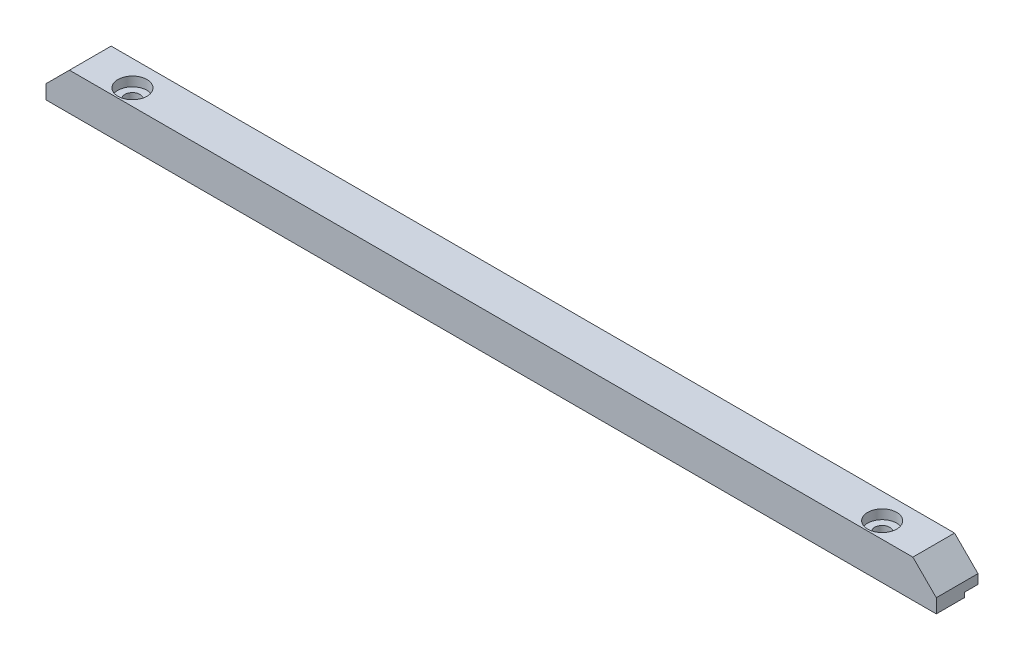
ISO-10303-21;
HEADER;
FILE_DESCRIPTION(('STEP AP214'),'2;1');
FILE_NAME('part.step','',(''),(''),'','','');
FILE_SCHEMA(('AUTOMOTIVE_DESIGN { 1 0 10303 214 1 1 1 1 }'));
ENDSEC;
DATA;
#1=APPLICATION_CONTEXT('core data for automotive mechanical design processes');
#2=APPLICATION_PROTOCOL_DEFINITION('international standard','automotive_design',2000,#1);
#3=PRODUCT_CONTEXT('',#1,'mechanical');
#4=PRODUCT('Part','Part','',(#3));
#5=PRODUCT_RELATED_PRODUCT_CATEGORY('part','',(#4));
#6=PRODUCT_DEFINITION_FORMATION('','',#4);
#7=PRODUCT_DEFINITION_CONTEXT('part definition',#1,'design');
#8=PRODUCT_DEFINITION('design','',#6,#7);
#9=PRODUCT_DEFINITION_SHAPE('','',#8);
#10=(LENGTH_UNIT() NAMED_UNIT(*) SI_UNIT(.MILLI.,.METRE.));
#11=(NAMED_UNIT(*) PLANE_ANGLE_UNIT() SI_UNIT($,.RADIAN.));
#12=(NAMED_UNIT(*) SI_UNIT($,.STERADIAN.) SOLID_ANGLE_UNIT());
#13=UNCERTAINTY_MEASURE_WITH_UNIT(LENGTH_MEASURE(1.E-05),#10,'distance_accuracy_value','');
#14=(GEOMETRIC_REPRESENTATION_CONTEXT(3) GLOBAL_UNCERTAINTY_ASSIGNED_CONTEXT((#13)) GLOBAL_UNIT_ASSIGNED_CONTEXT((#10,
#11,#12)) REPRESENTATION_CONTEXT('',''));
#15=CARTESIAN_POINT('',(0.,0.,0.));
#16=DIRECTION('',(0.,0.,1.));
#17=DIRECTION('',(1.,0.,0.));
#18=AXIS2_PLACEMENT_3D('',#15,#16,#17);
#19=CARTESIAN_POINT('',(0.,0.,0.));
#20=DIRECTION('',(0.,-1.,0.));
#21=DIRECTION('',(0.,0.,-1.));
#22=AXIS2_PLACEMENT_3D('',#19,#20,#21);
#23=PLANE('',#22);
#24=CARTESIAN_POINT('',(87.17,0.,-3.45));
#25=DIRECTION('',(0.,1.,0.));
#26=DIRECTION('',(0.,0.,1.));
#27=AXIS2_PLACEMENT_3D('',#24,#25,#26);
#28=CIRCLE('',#27,1.6);
#29=CARTESIAN_POINT('',(87.17,0.,-1.85));
#30=VERTEX_POINT('',#29);
#31=EDGE_CURVE('E193',#30,#30,#28,.T.);
#32=ORIENTED_EDGE('',*,*,#31,.T.);
#33=EDGE_LOOP('',(#32));
#34=FACE_BOUND('',#33,.T.);
#35=DIRECTION('',(1.,0.,0.));
#36=VECTOR('',#35,1.);
#37=CARTESIAN_POINT('',(0.,0.,0.));
#38=LINE('',#37,#36);
#39=CARTESIAN_POINT('',(72.17,0.,0.));
#40=VERTEX_POINT('',#39);
#41=CARTESIAN_POINT('',(262.17,0.,0.));
#42=VERTEX_POINT('',#41);
#43=EDGE_CURVE('E145',#40,#42,#38,.T.);
#44=ORIENTED_EDGE('',*,*,#43,.F.);
#45=DIRECTION('',(0.,0.,1.));
#46=VECTOR('',#45,1.);
#47=CARTESIAN_POINT('',(72.17,0.,-30.6891340642296));
#48=LINE('',#47,#46);
#49=CARTESIAN_POINT('',(72.17,0.,-8.9));
#50=VERTEX_POINT('',#49);
#51=EDGE_CURVE('E131',#50,#40,#48,.T.);
#52=ORIENTED_EDGE('',*,*,#51,.F.);
#53=DIRECTION('',(1.,0.,0.));
#54=VECTOR('',#53,1.);
#55=CARTESIAN_POINT('',(0.,0.,-8.9));
#56=LINE('',#55,#54);
#57=CARTESIAN_POINT('',(88.6474677821872,0.,-8.9));
#58=VERTEX_POINT('',#57);
#59=EDGE_CURVE('E141',#50,#58,#56,.T.);
#60=ORIENTED_EDGE('',*,*,#59,.T.);
#61=CARTESIAN_POINT('',(92.0884560123327,0.,-9.5400000000001));
#62=DIRECTION('',(0.,-1.,0.));
#63=DIRECTION('',(0.,0.,-1.));
#64=AXIS2_PLACEMENT_3D('',#61,#62,#63);
#65=CIRCLE('',#64,3.50000000000001);
#66=CARTESIAN_POINT('',(95.5294442424782,0.,-8.9));
#67=VERTEX_POINT('',#66);
#68=EDGE_CURVE('E175',#67,#58,#65,.T.);
#69=ORIENTED_EDGE('',*,*,#68,.F.);
#70=CARTESIAN_POINT('',(258.827467782187,0.,-8.9));
#71=VERTEX_POINT('',#70);
#72=EDGE_CURVE('E154',#67,#71,#56,.T.);
#73=ORIENTED_EDGE('',*,*,#72,.T.);
#74=CARTESIAN_POINT('',(262.268456012333,0.,-9.5400000000001));
#75=DIRECTION('',(0.,-1.,0.));
#76=DIRECTION('',(0.,0.,-1.));
#77=AXIS2_PLACEMENT_3D('',#74,#75,#76);
#78=CIRCLE('',#77,3.50000000000002);
#79=CARTESIAN_POINT('',(262.17,0.,-6.04138507211283));
#80=VERTEX_POINT('',#79);
#81=EDGE_CURVE('E185',#80,#71,#78,.T.);
#82=ORIENTED_EDGE('',*,*,#81,.F.);
#83=DIRECTION('',(0.,0.,-1.));
#84=VECTOR('',#83,1.);
#85=CARTESIAN_POINT('',(262.17,0.,-30.6891340642296));
#86=LINE('',#85,#84);
#87=EDGE_CURVE('E146',#42,#80,#86,.T.);
#88=ORIENTED_EDGE('',*,*,#87,.F.);
#89=EDGE_LOOP('',(#44,#52,#60,#69,#73,#82,#88));
#90=FACE_BOUND('',#89,.T.);
#91=CARTESIAN_POINT('',(247.17,0.,-3.45));
#92=DIRECTION('',(0.,1.,0.));
#93=DIRECTION('',(0.,0.,1.));
#94=AXIS2_PLACEMENT_3D('',#91,#92,#93);
#95=CIRCLE('',#94,1.59999999999999);
#96=CARTESIAN_POINT('',(247.17,0.,-1.85000000000001));
#97=VERTEX_POINT('',#96);
#98=EDGE_CURVE('E190',#97,#97,#95,.T.);
#99=ORIENTED_EDGE('',*,*,#98,.T.);
#100=EDGE_LOOP('',(#99));
#101=FACE_BOUND('',#100,.T.);
#102=ADVANCED_FACE('F49',(#34,#90,#101),#23,.T.);
#103=CARTESIAN_POINT('',(0.,8.,0.));
#104=DIRECTION('',(0.,-1.,0.));
#105=DIRECTION('',(0.,0.,-1.));
#106=AXIS2_PLACEMENT_3D('',#103,#104,#105);
#107=PLANE('',#106);
#108=CARTESIAN_POINT('',(247.17,8.,-3.45));
#109=DIRECTION('',(0.,1.,0.));
#110=DIRECTION('',(0.,0.,1.));
#111=AXIS2_PLACEMENT_3D('',#108,#109,#110);
#112=CIRCLE('',#111,3.09999999999999);
#113=CARTESIAN_POINT('',(247.17,8.,-0.350000000000012));
#114=VERTEX_POINT('',#113);
#115=EDGE_CURVE('E167',#114,#114,#112,.T.);
#116=ORIENTED_EDGE('',*,*,#115,.F.);
#117=EDGE_LOOP('',(#116));
#118=FACE_BOUND('',#117,.T.);
#119=CARTESIAN_POINT('',(87.17,8.,-3.45));
#120=DIRECTION('',(0.,1.,0.));
#121=DIRECTION('',(0.,0.,1.));
#122=AXIS2_PLACEMENT_3D('',#119,#120,#121);
#123=CIRCLE('',#122,3.1);
#124=CARTESIAN_POINT('',(87.17,8.,-0.349999999999998));
#125=VERTEX_POINT('',#124);
#126=EDGE_CURVE('E153',#125,#125,#123,.T.);
#127=ORIENTED_EDGE('',*,*,#126,.F.);
#128=EDGE_LOOP('',(#127));
#129=FACE_BOUND('',#128,.T.);
#130=DIRECTION('',(1.,0.,0.));
#131=VECTOR('',#130,1.);
#132=CARTESIAN_POINT('',(0.,8.,0.));
#133=LINE('',#132,#131);
#134=CARTESIAN_POINT('',(77.17,8.,0.));
#135=VERTEX_POINT('',#134);
#136=CARTESIAN_POINT('',(257.17,8.,0.));
#137=VERTEX_POINT('',#136);
#138=EDGE_CURVE('E196',#135,#137,#133,.T.);
#139=ORIENTED_EDGE('',*,*,#138,.T.);
#140=DIRECTION('',(0.,0.,-1.));
#141=VECTOR('',#140,1.);
#142=CARTESIAN_POINT('',(257.17,8.,-8.9));
#143=LINE('',#142,#141);
#144=CARTESIAN_POINT('',(257.17,8.,-8.9));
#145=VERTEX_POINT('',#144);
#146=EDGE_CURVE('E215',#137,#145,#143,.T.);
#147=ORIENTED_EDGE('',*,*,#146,.T.);
#148=DIRECTION('',(1.,0.,0.));
#149=VECTOR('',#148,1.);
#150=CARTESIAN_POINT('',(41.9,8.,-8.9));
#151=LINE('',#150,#149);
#152=CARTESIAN_POINT('',(77.17,8.,-8.9));
#153=VERTEX_POINT('',#152);
#154=EDGE_CURVE('E188',#153,#145,#151,.T.);
#155=ORIENTED_EDGE('',*,*,#154,.F.);
#156=DIRECTION('',(0.,0.,1.));
#157=VECTOR('',#156,1.);
#158=CARTESIAN_POINT('',(77.17,8.,0.));
#159=LINE('',#158,#157);
#160=EDGE_CURVE('E136',#153,#135,#159,.T.);
#161=ORIENTED_EDGE('',*,*,#160,.T.);
#162=EDGE_LOOP('',(#139,#147,#155,#161));
#163=FACE_BOUND('',#162,.T.);
#164=ADVANCED_FACE('F229',(#118,#129,#163),#107,.F.);
#165=CARTESIAN_POINT('',(0.,8.,0.));
#166=DIRECTION('',(0.,0.,-1.));
#167=DIRECTION('',(-1.,0.,0.));
#168=AXIS2_PLACEMENT_3D('',#165,#166,#167);
#169=PLANE('',#168);
#170=DIRECTION('',(0.,1.,0.));
#171=VECTOR('',#170,1.);
#172=CARTESIAN_POINT('',(72.17,8.,0.));
#173=LINE('',#172,#171);
#174=CARTESIAN_POINT('',(72.17,2.99999999999997,0.));
#175=VERTEX_POINT('',#174);
#176=EDGE_CURVE('E159',#40,#175,#173,.T.);
#177=ORIENTED_EDGE('',*,*,#176,.F.);
#178=ORIENTED_EDGE('',*,*,#43,.T.);
#179=DIRECTION('',(0.,-1.,0.));
#180=VECTOR('',#179,1.);
#181=CARTESIAN_POINT('',(262.17,8.,0.));
#182=LINE('',#181,#180);
#183=CARTESIAN_POINT('',(262.17,2.99999999999997,0.));
#184=VERTEX_POINT('',#183);
#185=EDGE_CURVE('E225',#184,#42,#182,.T.);
#186=ORIENTED_EDGE('',*,*,#185,.F.);
#187=DIRECTION('',(-0.707106781186549,0.707106781186546,0.));
#188=VECTOR('',#187,1.);
#189=CARTESIAN_POINT('',(257.17,8.,0.));
#190=LINE('',#189,#188);
#191=EDGE_CURVE('E58',#184,#137,#190,.T.);
#192=ORIENTED_EDGE('',*,*,#191,.T.);
#193=ORIENTED_EDGE('',*,*,#138,.F.);
#194=DIRECTION('',(-0.707106781186548,-0.707106781186548,0.));
#195=VECTOR('',#194,1.);
#196=CARTESIAN_POINT('',(77.17,8.,0.));
#197=LINE('',#196,#195);
#198=EDGE_CURVE('E65',#135,#175,#197,.T.);
#199=ORIENTED_EDGE('',*,*,#198,.T.);
#200=EDGE_LOOP('',(#177,#178,#186,#192,#193,#199));
#201=FACE_BOUND('',#200,.T.);
#202=ADVANCED_FACE('F224',(#201),#169,.F.);
#203=CARTESIAN_POINT('',(0.,0.,-8.9));
#204=DIRECTION('',(0.,0.,-1.));
#205=DIRECTION('',(-1.,0.,0.));
#206=AXIS2_PLACEMENT_3D('',#203,#204,#205);
#207=PLANE('',#206);
#208=ORIENTED_EDGE('',*,*,#154,.T.);
#209=DIRECTION('',(0.707106781186549,-0.707106781186546,0.));
#210=VECTOR('',#209,1.);
#211=CARTESIAN_POINT('',(132.584999999999,132.585,-8.9));
#212=LINE('',#211,#210);
#213=CARTESIAN_POINT('',(262.17,2.99999999999997,-8.9));
#214=VERTEX_POINT('',#213);
#215=EDGE_CURVE('E220',#145,#214,#212,.T.);
#216=ORIENTED_EDGE('',*,*,#215,.T.);
#217=DIRECTION('',(0.,-1.,0.));
#218=VECTOR('',#217,1.);
#219=CARTESIAN_POINT('',(262.17,0.,-8.9));
#220=LINE('',#219,#218);
#221=CARTESIAN_POINT('',(262.17,1.,-8.9));
#222=VERTEX_POINT('',#221);
#223=EDGE_CURVE('E233',#214,#222,#220,.T.);
#224=ORIENTED_EDGE('',*,*,#223,.T.);
#225=DIRECTION('',(-1.,0.,0.));
#226=VECTOR('',#225,1.);
#227=CARTESIAN_POINT('',(0.,1.,-8.9));
#228=LINE('',#227,#226);
#229=CARTESIAN_POINT('',(258.827467782187,1.,-8.9));
#230=VERTEX_POINT('',#229);
#231=EDGE_CURVE('E199',#222,#230,#228,.T.);
#232=ORIENTED_EDGE('',*,*,#231,.T.);
#233=DIRECTION('',(0.,-1.,0.));
#234=VECTOR('',#233,1.);
#235=CARTESIAN_POINT('',(258.827467782187,1.,-8.9));
#236=LINE('',#235,#234);
#237=EDGE_CURVE('E202',#71,#230,#236,.F.);
#238=ORIENTED_EDGE('',*,*,#237,.F.);
#239=ORIENTED_EDGE('',*,*,#72,.F.);
#240=DIRECTION('',(0.,-1.,0.));
#241=VECTOR('',#240,1.);
#242=CARTESIAN_POINT('',(95.5294442424782,1.,-8.9));
#243=LINE('',#242,#241);
#244=CARTESIAN_POINT('',(95.5294442424782,1.,-8.9));
#245=VERTEX_POINT('',#244);
#246=EDGE_CURVE('E182',#245,#67,#243,.T.);
#247=ORIENTED_EDGE('',*,*,#246,.F.);
#248=DIRECTION('',(-1.,0.,0.));
#249=VECTOR('',#248,1.);
#250=CARTESIAN_POINT('',(0.,1.,-8.9));
#251=LINE('',#250,#249);
#252=CARTESIAN_POINT('',(88.6474677821872,1.,-8.9));
#253=VERTEX_POINT('',#252);
#254=EDGE_CURVE('E205',#245,#253,#251,.T.);
#255=ORIENTED_EDGE('',*,*,#254,.T.);
#256=DIRECTION('',(0.,-1.,0.));
#257=VECTOR('',#256,1.);
#258=CARTESIAN_POINT('',(88.6474677821872,1.,-8.9));
#259=LINE('',#258,#257);
#260=EDGE_CURVE('E152',#58,#253,#259,.F.);
#261=ORIENTED_EDGE('',*,*,#260,.F.);
#262=ORIENTED_EDGE('',*,*,#59,.F.);
#263=DIRECTION('',(0.,1.,0.));
#264=VECTOR('',#263,1.);
#265=CARTESIAN_POINT('',(72.17,0.,-8.9));
#266=LINE('',#265,#264);
#267=CARTESIAN_POINT('',(72.17,2.99999999999997,-8.9));
#268=VERTEX_POINT('',#267);
#269=EDGE_CURVE('E128',#50,#268,#266,.T.);
#270=ORIENTED_EDGE('',*,*,#269,.T.);
#271=DIRECTION('',(0.707106781186548,0.707106781186548,0.));
#272=VECTOR('',#271,1.);
#273=CARTESIAN_POINT('',(34.585,-34.585,-8.9));
#274=LINE('',#273,#272);
#275=EDGE_CURVE('E218',#268,#153,#274,.T.);
#276=ORIENTED_EDGE('',*,*,#275,.T.);
#277=EDGE_LOOP('',(#208,#216,#224,#232,#238,#239,#247,#255,#261,#262,#270,#276));
#278=FACE_BOUND('',#277,.T.);
#279=ADVANCED_FACE('F150',(#278),#207,.T.);
#280=CARTESIAN_POINT('',(262.268456012333,1.,-9.5400000000001));
#281=DIRECTION('',(0.,-1.,0.));
#282=DIRECTION('',(0.,0.,-1.));
#283=AXIS2_PLACEMENT_3D('',#280,#281,#282);
#284=CYLINDRICAL_SURFACE('',#283,3.50000000000002);
#285=DIRECTION('',(0.,-1.,0.));
#286=VECTOR('',#285,1.);
#287=CARTESIAN_POINT('',(262.17,1.,-6.04138507211282));
#288=LINE('',#287,#286);
#289=CARTESIAN_POINT('',(262.17,1.,-6.04138507211282));
#290=VERTEX_POINT('',#289);
#291=EDGE_CURVE('E237',#80,#290,#288,.F.);
#292=ORIENTED_EDGE('',*,*,#291,.F.);
#293=ORIENTED_EDGE('',*,*,#81,.T.);
#294=ORIENTED_EDGE('',*,*,#237,.T.);
#295=CARTESIAN_POINT('',(262.268456012333,1.,-9.5400000000001));
#296=DIRECTION('',(0.,-1.,0.));
#297=DIRECTION('',(0.,0.,-1.));
#298=AXIS2_PLACEMENT_3D('',#295,#296,#297);
#299=CIRCLE('',#298,3.50000000000002);
#300=EDGE_CURVE('E176',#290,#230,#299,.T.);
#301=ORIENTED_EDGE('',*,*,#300,.F.);
#302=EDGE_LOOP('',(#292,#293,#294,#301));
#303=FACE_BOUND('',#302,.T.);
#304=ADVANCED_FACE('F245',(#303),#284,.F.);
#305=CARTESIAN_POINT('',(262.268456012333,1.,-9.5400000000001));
#306=DIRECTION('',(0.,-1.,0.));
#307=DIRECTION('',(0.,0.,-1.));
#308=AXIS2_PLACEMENT_3D('',#305,#306,#307);
#309=PLANE('',#308);
#310=ORIENTED_EDGE('',*,*,#231,.F.);
#311=DIRECTION('',(0.,0.,1.));
#312=VECTOR('',#311,1.);
#313=CARTESIAN_POINT('',(262.17,1.,-9.5400000000001));
#314=LINE('',#313,#312);
#315=EDGE_CURVE('E137',#222,#290,#314,.T.);
#316=ORIENTED_EDGE('',*,*,#315,.T.);
#317=ORIENTED_EDGE('',*,*,#300,.T.);
#318=EDGE_LOOP('',(#310,#316,#317));
#319=FACE_BOUND('',#318,.T.);
#320=ADVANCED_FACE('F313',(#319),#309,.T.);
#321=CARTESIAN_POINT('',(87.17,8.,-3.45));
#322=DIRECTION('',(0.,1.,0.));
#323=DIRECTION('',(0.,0.,1.));
#324=AXIS2_PLACEMENT_3D('',#321,#322,#323);
#325=CYLINDRICAL_SURFACE('',#324,1.6);
#326=ORIENTED_EDGE('',*,*,#31,.F.);
#327=EDGE_LOOP('',(#326));
#328=FACE_BOUND('',#327,.T.);
#329=CARTESIAN_POINT('',(87.17,6.,-3.45));
#330=DIRECTION('',(0.,1.,0.));
#331=DIRECTION('',(0.,0.,1.));
#332=AXIS2_PLACEMENT_3D('',#329,#330,#331);
#333=CIRCLE('',#332,1.6);
#334=CARTESIAN_POINT('',(87.17,6.,-1.85));
#335=VERTEX_POINT('',#334);
#336=EDGE_CURVE('E179',#335,#335,#333,.F.);
#337=ORIENTED_EDGE('',*,*,#336,.F.);
#338=EDGE_LOOP('',(#337));
#339=FACE_BOUND('',#338,.T.);
#340=ADVANCED_FACE('F311',(#328,#339),#325,.F.);
#341=CARTESIAN_POINT('',(247.17,8.,-3.45));
#342=DIRECTION('',(0.,1.,0.));
#343=DIRECTION('',(0.,0.,1.));
#344=AXIS2_PLACEMENT_3D('',#341,#342,#343);
#345=CYLINDRICAL_SURFACE('',#344,1.59999999999999);
#346=ORIENTED_EDGE('',*,*,#98,.F.);
#347=EDGE_LOOP('',(#346));
#348=FACE_BOUND('',#347,.T.);
#349=CARTESIAN_POINT('',(247.17,6.,-3.45));
#350=DIRECTION('',(0.,1.,0.));
#351=DIRECTION('',(0.,0.,1.));
#352=AXIS2_PLACEMENT_3D('',#349,#350,#351);
#353=CIRCLE('',#352,1.59999999999999);
#354=CARTESIAN_POINT('',(247.17,6.,-1.85000000000001));
#355=VERTEX_POINT('',#354);
#356=EDGE_CURVE('E166',#355,#355,#353,.F.);
#357=ORIENTED_EDGE('',*,*,#356,.F.);
#358=EDGE_LOOP('',(#357));
#359=FACE_BOUND('',#358,.T.);
#360=ADVANCED_FACE('F264',(#348,#359),#345,.F.);
#361=CARTESIAN_POINT('',(92.0884560123327,1.,-9.5400000000001));
#362=DIRECTION('',(0.,-1.,0.));
#363=DIRECTION('',(0.,0.,-1.));
#364=AXIS2_PLACEMENT_3D('',#361,#362,#363);
#365=CYLINDRICAL_SURFACE('',#364,3.50000000000001);
#366=ORIENTED_EDGE('',*,*,#68,.T.);
#367=ORIENTED_EDGE('',*,*,#260,.T.);
#368=CARTESIAN_POINT('',(92.0884560123327,1.,-9.5400000000001));
#369=DIRECTION('',(0.,-1.,0.));
#370=DIRECTION('',(0.,0.,-1.));
#371=AXIS2_PLACEMENT_3D('',#368,#369,#370);
#372=CIRCLE('',#371,3.50000000000001);
#373=EDGE_CURVE('E172',#245,#253,#372,.T.);
#374=ORIENTED_EDGE('',*,*,#373,.F.);
#375=ORIENTED_EDGE('',*,*,#246,.T.);
#376=EDGE_LOOP('',(#366,#367,#374,#375));
#377=FACE_BOUND('',#376,.T.);
#378=ADVANCED_FACE('F251',(#377),#365,.F.);
#379=CARTESIAN_POINT('',(92.0884560123327,1.,-9.5400000000001));
#380=DIRECTION('',(0.,-1.,0.));
#381=DIRECTION('',(0.,0.,-1.));
#382=AXIS2_PLACEMENT_3D('',#379,#380,#381);
#383=PLANE('',#382);
#384=ORIENTED_EDGE('',*,*,#373,.T.);
#385=ORIENTED_EDGE('',*,*,#254,.F.);
#386=EDGE_LOOP('',(#384,#385));
#387=FACE_BOUND('',#386,.T.);
#388=ADVANCED_FACE('F253',(#387),#383,.T.);
#389=CARTESIAN_POINT('',(247.17,6.,-3.45));
#390=DIRECTION('',(0.,1.,0.));
#391=DIRECTION('',(0.,0.,1.));
#392=AXIS2_PLACEMENT_3D('',#389,#390,#391);
#393=PLANE('',#392);
#394=CARTESIAN_POINT('',(247.17,6.,-3.45));
#395=DIRECTION('',(0.,1.,0.));
#396=DIRECTION('',(0.,0.,1.));
#397=AXIS2_PLACEMENT_3D('',#394,#395,#396);
#398=CIRCLE('',#397,3.09999999999999);
#399=CARTESIAN_POINT('',(247.17,6.,-0.350000000000012));
#400=VERTEX_POINT('',#399);
#401=EDGE_CURVE('E163',#400,#400,#398,.T.);
#402=ORIENTED_EDGE('',*,*,#401,.T.);
#403=EDGE_LOOP('',(#402));
#404=FACE_BOUND('',#403,.T.);
#405=ORIENTED_EDGE('',*,*,#356,.T.);
#406=EDGE_LOOP('',(#405));
#407=FACE_BOUND('',#406,.T.);
#408=ADVANCED_FACE('F255',(#404,#407),#393,.T.);
#409=CARTESIAN_POINT('',(247.17,6.,-3.45));
#410=DIRECTION('',(0.,1.,0.));
#411=DIRECTION('',(0.,0.,1.));
#412=AXIS2_PLACEMENT_3D('',#409,#410,#411);
#413=CYLINDRICAL_SURFACE('',#412,3.09999999999999);
#414=ORIENTED_EDGE('',*,*,#401,.F.);
#415=EDGE_LOOP('',(#414));
#416=FACE_BOUND('',#415,.T.);
#417=ORIENTED_EDGE('',*,*,#115,.T.);
#418=EDGE_LOOP('',(#417));
#419=FACE_BOUND('',#418,.T.);
#420=ADVANCED_FACE('F261',(#416,#419),#413,.F.);
#421=CARTESIAN_POINT('',(87.17,6.,-3.45));
#422=DIRECTION('',(0.,1.,0.));
#423=DIRECTION('',(0.,0.,1.));
#424=AXIS2_PLACEMENT_3D('',#421,#422,#423);
#425=PLANE('',#424);
#426=CARTESIAN_POINT('',(87.17,6.,-3.45));
#427=DIRECTION('',(0.,1.,0.));
#428=DIRECTION('',(0.,0.,1.));
#429=AXIS2_PLACEMENT_3D('',#426,#427,#428);
#430=CIRCLE('',#429,3.1);
#431=CARTESIAN_POINT('',(87.17,6.,-0.349999999999998));
#432=VERTEX_POINT('',#431);
#433=EDGE_CURVE('E157',#432,#432,#430,.T.);
#434=ORIENTED_EDGE('',*,*,#433,.T.);
#435=EDGE_LOOP('',(#434));
#436=FACE_BOUND('',#435,.T.);
#437=ORIENTED_EDGE('',*,*,#336,.T.);
#438=EDGE_LOOP('',(#437));
#439=FACE_BOUND('',#438,.T.);
#440=ADVANCED_FACE('F296',(#436,#439),#425,.T.);
#441=CARTESIAN_POINT('',(87.17,6.,-3.45));
#442=DIRECTION('',(0.,1.,0.));
#443=DIRECTION('',(0.,0.,1.));
#444=AXIS2_PLACEMENT_3D('',#441,#442,#443);
#445=CYLINDRICAL_SURFACE('',#444,3.1);
#446=ORIENTED_EDGE('',*,*,#433,.F.);
#447=EDGE_LOOP('',(#446));
#448=FACE_BOUND('',#447,.T.);
#449=ORIENTED_EDGE('',*,*,#126,.T.);
#450=EDGE_LOOP('',(#449));
#451=FACE_BOUND('',#450,.T.);
#452=ADVANCED_FACE('F291',(#448,#451),#445,.F.);
#453=CARTESIAN_POINT('',(262.17,0.,-30.6891340642296));
#454=DIRECTION('',(1.,0.,0.));
#455=DIRECTION('',(0.,0.,-1.));
#456=AXIS2_PLACEMENT_3D('',#453,#454,#455);
#457=PLANE('',#456);
#458=ORIENTED_EDGE('',*,*,#223,.F.);
#459=DIRECTION('',(0.,0.,1.));
#460=VECTOR('',#459,1.);
#461=CARTESIAN_POINT('',(262.17,2.99999999999997,0.));
#462=LINE('',#461,#460);
#463=EDGE_CURVE('E73',#214,#184,#462,.T.);
#464=ORIENTED_EDGE('',*,*,#463,.T.);
#465=ORIENTED_EDGE('',*,*,#185,.T.);
#466=ORIENTED_EDGE('',*,*,#87,.T.);
#467=ORIENTED_EDGE('',*,*,#291,.T.);
#468=ORIENTED_EDGE('',*,*,#315,.F.);
#469=EDGE_LOOP('',(#458,#464,#465,#466,#467,#468));
#470=FACE_BOUND('',#469,.T.);
#471=ADVANCED_FACE('F235',(#470),#457,.T.);
#472=CARTESIAN_POINT('',(72.17,0.,-30.6891340642296));
#473=DIRECTION('',(-1.,0.,0.));
#474=DIRECTION('',(0.,0.,1.));
#475=AXIS2_PLACEMENT_3D('',#472,#473,#474);
#476=PLANE('',#475);
#477=ORIENTED_EDGE('',*,*,#176,.T.);
#478=DIRECTION('',(0.,0.,-1.));
#479=VECTOR('',#478,1.);
#480=CARTESIAN_POINT('',(72.17,2.99999999999997,-8.9));
#481=LINE('',#480,#479);
#482=EDGE_CURVE('E12',#175,#268,#481,.T.);
#483=ORIENTED_EDGE('',*,*,#482,.T.);
#484=ORIENTED_EDGE('',*,*,#269,.F.);
#485=ORIENTED_EDGE('',*,*,#51,.T.);
#486=EDGE_LOOP('',(#477,#483,#484,#485));
#487=FACE_BOUND('',#486,.T.);
#488=ADVANCED_FACE('F130',(#487),#476,.T.);
#489=CARTESIAN_POINT('',(257.17,8.,0.));
#490=DIRECTION('',(0.707106781186546,0.707106781186549,0.));
#491=DIRECTION('',(0.,0.,1.));
#492=AXIS2_PLACEMENT_3D('',#489,#490,#491);
#493=PLANE('',#492);
#494=ORIENTED_EDGE('',*,*,#191,.F.);
#495=ORIENTED_EDGE('',*,*,#463,.F.);
#496=ORIENTED_EDGE('',*,*,#215,.F.);
#497=ORIENTED_EDGE('',*,*,#146,.F.);
#498=EDGE_LOOP('',(#494,#495,#496,#497));
#499=FACE_BOUND('',#498,.T.);
#500=ADVANCED_FACE('F232',(#499),#493,.T.);
#501=CARTESIAN_POINT('',(77.17,8.,0.));
#502=DIRECTION('',(-0.707106781186547,0.707106781186547,0.));
#503=DIRECTION('',(0.,0.,-1.));
#504=AXIS2_PLACEMENT_3D('',#501,#502,#503);
#505=PLANE('',#504);
#506=ORIENTED_EDGE('',*,*,#275,.F.);
#507=ORIENTED_EDGE('',*,*,#482,.F.);
#508=ORIENTED_EDGE('',*,*,#198,.F.);
#509=ORIENTED_EDGE('',*,*,#160,.F.);
#510=EDGE_LOOP('',(#506,#507,#508,#509));
#511=FACE_BOUND('',#510,.T.);
#512=ADVANCED_FACE('F52',(#511),#505,.T.);
#513=CLOSED_SHELL('',(#102,#164,#202,#279,#304,#320,#340,#360,#378,#388,#408,#420,#440,#452,
#471,#488,#500,#512));
#514=MANIFOLD_SOLID_BREP('B2',#513);
#515=ADVANCED_BREP_SHAPE_REPRESENTATION('',(#18,#514),#14);
#516=SHAPE_DEFINITION_REPRESENTATION(#9,#515);
ENDSEC;
END-ISO-10303-21;
